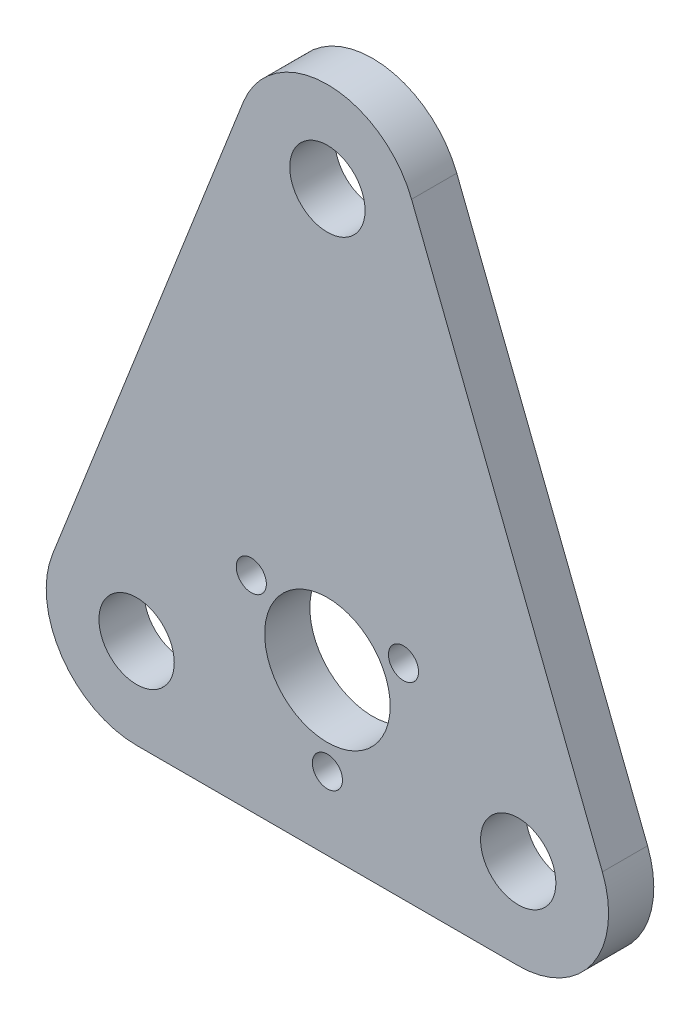
ISO-10303-21;
HEADER;
FILE_DESCRIPTION(('STEP AP214'),'2;1');
FILE_NAME('part.step','',(''),(''),'','','');
FILE_SCHEMA(('AUTOMOTIVE_DESIGN { 1 0 10303 214 1 1 1 1 }'));
ENDSEC;
DATA;
#1=APPLICATION_CONTEXT('core data for automotive mechanical design processes');
#2=APPLICATION_PROTOCOL_DEFINITION('international standard','automotive_design',2000,#1);
#3=PRODUCT_CONTEXT('',#1,'mechanical');
#4=PRODUCT('Part','Part','',(#3));
#5=PRODUCT_RELATED_PRODUCT_CATEGORY('part','',(#4));
#6=PRODUCT_DEFINITION_FORMATION('','',#4);
#7=PRODUCT_DEFINITION_CONTEXT('part definition',#1,'design');
#8=PRODUCT_DEFINITION('design','',#6,#7);
#9=PRODUCT_DEFINITION_SHAPE('','',#8);
#10=(LENGTH_UNIT() NAMED_UNIT(*) SI_UNIT(.MILLI.,.METRE.));
#11=(NAMED_UNIT(*) PLANE_ANGLE_UNIT() SI_UNIT($,.RADIAN.));
#12=(NAMED_UNIT(*) SI_UNIT($,.STERADIAN.) SOLID_ANGLE_UNIT());
#13=UNCERTAINTY_MEASURE_WITH_UNIT(LENGTH_MEASURE(1.E-05),#10,'distance_accuracy_value','');
#14=(GEOMETRIC_REPRESENTATION_CONTEXT(3) GLOBAL_UNCERTAINTY_ASSIGNED_CONTEXT((#13)) GLOBAL_UNIT_ASSIGNED_CONTEXT((#10,
#11,#12)) REPRESENTATION_CONTEXT('',''));
#15=CARTESIAN_POINT('',(0.,0.,0.));
#16=DIRECTION('',(0.,0.,1.));
#17=DIRECTION('',(1.,0.,0.));
#18=AXIS2_PLACEMENT_3D('',#15,#16,#17);
#19=CARTESIAN_POINT('',(44.9490759581409,17.6089163547356,4.5));
#20=DIRECTION('',(0.931101085074803,0.364761249823119,0.));
#21=DIRECTION('',(-0.364761249823119,0.931101085074803,0.));
#22=AXIS2_PLACEMENT_3D('',#19,#20,#21);
#23=PLANE('',#22);
#24=DIRECTION('',(0.364761249823119,-0.931101085074803,0.));
#25=VECTOR('',#24,1.);
#26=CARTESIAN_POINT('',(44.9490759581409,17.6089163547356,-4.5));
#27=LINE('',#26,#25);
#28=CARTESIAN_POINT('',(16.7598195313465,89.5657024968162,-4.5));
#29=VERTEX_POINT('',#28);
#30=CARTESIAN_POINT('',(54.7598195313465,-7.43429750318386,-4.5));
#31=VERTEX_POINT('',#30);
#32=EDGE_CURVE('E148',#29,#31,#27,.T.);
#33=ORIENTED_EDGE('',*,*,#32,.F.);
#34=DIRECTION('',(0.,0.,-1.));
#35=VECTOR('',#34,1.);
#36=CARTESIAN_POINT('',(16.7598195313465,89.5657024968162,4.5));
#37=LINE('',#36,#35);
#38=CARTESIAN_POINT('',(16.7598195313465,89.5657024968162,4.5));
#39=VERTEX_POINT('',#38);
#40=EDGE_CURVE('E11',#39,#29,#37,.T.);
#41=ORIENTED_EDGE('',*,*,#40,.F.);
#42=DIRECTION('',(0.364761249823119,-0.931101085074803,0.));
#43=VECTOR('',#42,1.);
#44=CARTESIAN_POINT('',(44.9490759581409,17.6089163547356,4.5));
#45=LINE('',#44,#43);
#46=CARTESIAN_POINT('',(54.7598195313465,-7.43429750318386,4.5));
#47=VERTEX_POINT('',#46);
#48=EDGE_CURVE('E329',#39,#47,#45,.T.);
#49=ORIENTED_EDGE('',*,*,#48,.T.);
#50=DIRECTION('',(0.,0.,-1.));
#51=VECTOR('',#50,1.);
#52=CARTESIAN_POINT('',(54.7598195313465,-7.43429750318386,4.5));
#53=LINE('',#52,#51);
#54=EDGE_CURVE('E90',#47,#31,#53,.T.);
#55=ORIENTED_EDGE('',*,*,#54,.T.);
#56=EDGE_LOOP('',(#33,#41,#49,#55));
#57=FACE_BOUND('',#56,.T.);
#58=ADVANCED_FACE('F45',(#57),#23,.T.);
#59=CARTESIAN_POINT('',(0.,83.,4.5));
#60=DIRECTION('',(0.,0.,-1.));
#61=DIRECTION('',(-1.,0.,0.));
#62=AXIS2_PLACEMENT_3D('',#59,#60,#61);
#63=CYLINDRICAL_SURFACE('',#62,18.);
#64=CARTESIAN_POINT('',(0.,83.,-4.5));
#65=DIRECTION('',(0.,0.,1.));
#66=DIRECTION('',(1.,0.,0.));
#67=AXIS2_PLACEMENT_3D('',#64,#65,#66);
#68=CIRCLE('',#67,18.);
#69=CARTESIAN_POINT('',(-16.7598195313465,89.5657024968161,-4.5));
#70=VERTEX_POINT('',#69);
#71=EDGE_CURVE('E151',#29,#70,#68,.T.);
#72=ORIENTED_EDGE('',*,*,#71,.T.);
#73=DIRECTION('',(0.,0.,-1.));
#74=VECTOR('',#73,1.);
#75=CARTESIAN_POINT('',(-16.7598195313465,89.5657024968161,4.5));
#76=LINE('',#75,#74);
#77=CARTESIAN_POINT('',(-16.7598195313465,89.5657024968161,4.5));
#78=VERTEX_POINT('',#77);
#79=EDGE_CURVE('E54',#78,#70,#76,.T.);
#80=ORIENTED_EDGE('',*,*,#79,.F.);
#81=CARTESIAN_POINT('',(0.,83.,4.5));
#82=DIRECTION('',(0.,0.,1.));
#83=DIRECTION('',(1.,0.,0.));
#84=AXIS2_PLACEMENT_3D('',#81,#82,#83);
#85=CIRCLE('',#84,18.);
#86=EDGE_CURVE('E330',#39,#78,#85,.T.);
#87=ORIENTED_EDGE('',*,*,#86,.F.);
#88=ORIENTED_EDGE('',*,*,#40,.T.);
#89=EDGE_LOOP('',(#72,#80,#87,#88));
#90=FACE_BOUND('',#89,.T.);
#91=ADVANCED_FACE('F171',(#90),#63,.T.);
#92=CARTESIAN_POINT('',(-44.9490759581409,17.6089163547356,4.5));
#93=DIRECTION('',(0.931101085074803,-0.364761249823119,0.));
#94=DIRECTION('',(0.364761249823119,0.931101085074803,0.));
#95=AXIS2_PLACEMENT_3D('',#92,#93,#94);
#96=PLANE('',#95);
#97=DIRECTION('',(-0.364761249823119,-0.931101085074803,0.));
#98=VECTOR('',#97,1.);
#99=CARTESIAN_POINT('',(-44.9490759581409,17.6089163547356,-4.5));
#100=LINE('',#99,#98);
#101=CARTESIAN_POINT('',(-54.7598195313465,-7.43429750318387,-4.5));
#102=VERTEX_POINT('',#101);
#103=EDGE_CURVE('E154',#70,#102,#100,.T.);
#104=ORIENTED_EDGE('',*,*,#103,.T.);
#105=DIRECTION('',(0.,0.,-1.));
#106=VECTOR('',#105,1.);
#107=CARTESIAN_POINT('',(-54.7598195313465,-7.43429750318387,4.5));
#108=LINE('',#107,#106);
#109=CARTESIAN_POINT('',(-54.7598195313465,-7.43429750318387,4.5));
#110=VERTEX_POINT('',#109);
#111=EDGE_CURVE('E120',#110,#102,#108,.T.);
#112=ORIENTED_EDGE('',*,*,#111,.F.);
#113=DIRECTION('',(-0.364761249823119,-0.931101085074803,0.));
#114=VECTOR('',#113,1.);
#115=CARTESIAN_POINT('',(-44.9490759581409,17.6089163547356,4.5));
#116=LINE('',#115,#114);
#117=EDGE_CURVE('E108',#78,#110,#116,.T.);
#118=ORIENTED_EDGE('',*,*,#117,.F.);
#119=ORIENTED_EDGE('',*,*,#79,.T.);
#120=EDGE_LOOP('',(#104,#112,#118,#119));
#121=FACE_BOUND('',#120,.T.);
#122=ADVANCED_FACE('F168',(#121),#96,.F.);
#123=CARTESIAN_POINT('',(-38.,-14.,4.5));
#124=DIRECTION('',(0.,0.,-1.));
#125=DIRECTION('',(-1.,0.,0.));
#126=AXIS2_PLACEMENT_3D('',#123,#124,#125);
#127=CYLINDRICAL_SURFACE('',#126,18.);
#128=CARTESIAN_POINT('',(-38.,-14.,-4.5));
#129=DIRECTION('',(0.,0.,1.));
#130=DIRECTION('',(1.,0.,0.));
#131=AXIS2_PLACEMENT_3D('',#128,#129,#130);
#132=CIRCLE('',#131,18.);
#133=CARTESIAN_POINT('',(-38.,-32.,-4.5));
#134=VERTEX_POINT('',#133);
#135=EDGE_CURVE('E116',#102,#134,#132,.T.);
#136=ORIENTED_EDGE('',*,*,#135,.T.);
#137=DIRECTION('',(0.,0.,-1.));
#138=VECTOR('',#137,1.);
#139=CARTESIAN_POINT('',(-38.,-32.,4.5));
#140=LINE('',#139,#138);
#141=CARTESIAN_POINT('',(-38.,-32.,4.5));
#142=VERTEX_POINT('',#141);
#143=EDGE_CURVE('E114',#142,#134,#140,.T.);
#144=ORIENTED_EDGE('',*,*,#143,.F.);
#145=CARTESIAN_POINT('',(-38.,-14.,4.5));
#146=DIRECTION('',(0.,0.,1.));
#147=DIRECTION('',(1.,0.,0.));
#148=AXIS2_PLACEMENT_3D('',#145,#146,#147);
#149=CIRCLE('',#148,18.);
#150=EDGE_CURVE('E102',#110,#142,#149,.T.);
#151=ORIENTED_EDGE('',*,*,#150,.F.);
#152=ORIENTED_EDGE('',*,*,#111,.T.);
#153=EDGE_LOOP('',(#136,#144,#151,#152));
#154=FACE_BOUND('',#153,.T.);
#155=ADVANCED_FACE('F115',(#154),#127,.T.);
#156=CARTESIAN_POINT('',(0.,-32.,4.5));
#157=DIRECTION('',(0.,-1.,0.));
#158=DIRECTION('',(1.,0.,0.));
#159=AXIS2_PLACEMENT_3D('',#156,#157,#158);
#160=PLANE('',#159);
#161=DIRECTION('',(-1.,0.,0.));
#162=VECTOR('',#161,1.);
#163=CARTESIAN_POINT('',(0.,-32.,-4.5));
#164=LINE('',#163,#162);
#165=CARTESIAN_POINT('',(38.,-32.,-4.5));
#166=VERTEX_POINT('',#165);
#167=EDGE_CURVE('E158',#166,#134,#164,.T.);
#168=ORIENTED_EDGE('',*,*,#167,.F.);
#169=DIRECTION('',(0.,0.,-1.));
#170=VECTOR('',#169,1.);
#171=CARTESIAN_POINT('',(38.,-32.,4.5));
#172=LINE('',#171,#170);
#173=CARTESIAN_POINT('',(38.,-32.,4.5));
#174=VERTEX_POINT('',#173);
#175=EDGE_CURVE('E83',#174,#166,#172,.T.);
#176=ORIENTED_EDGE('',*,*,#175,.F.);
#177=DIRECTION('',(-1.,0.,0.));
#178=VECTOR('',#177,1.);
#179=CARTESIAN_POINT('',(0.,-32.,4.5));
#180=LINE('',#179,#178);
#181=EDGE_CURVE('E106',#174,#142,#180,.T.);
#182=ORIENTED_EDGE('',*,*,#181,.T.);
#183=ORIENTED_EDGE('',*,*,#143,.T.);
#184=EDGE_LOOP('',(#168,#176,#182,#183));
#185=FACE_BOUND('',#184,.T.);
#186=ADVANCED_FACE('F122',(#185),#160,.T.);
#187=CARTESIAN_POINT('',(-15.1554445662276,8.75000000000006,4.5));
#188=DIRECTION('',(0.,0.,-1.));
#189=DIRECTION('',(-1.,0.,0.));
#190=AXIS2_PLACEMENT_3D('',#187,#188,#189);
#191=CYLINDRICAL_SURFACE('',#190,3.);
#192=CARTESIAN_POINT('',(-15.1554445662276,8.75000000000006,4.5));
#193=DIRECTION('',(0.,0.,1.));
#194=DIRECTION('',(1.,0.,0.));
#195=AXIS2_PLACEMENT_3D('',#192,#193,#194);
#196=CIRCLE('',#195,3.);
#197=CARTESIAN_POINT('',(-12.1554445662276,8.75000000000006,4.5));
#198=VERTEX_POINT('',#197);
#199=EDGE_CURVE('E331',#198,#198,#196,.T.);
#200=ORIENTED_EDGE('',*,*,#199,.T.);
#201=EDGE_LOOP('',(#200));
#202=FACE_BOUND('',#201,.T.);
#203=CARTESIAN_POINT('',(-15.1554445662276,8.75000000000006,-4.5));
#204=DIRECTION('',(0.,0.,1.));
#205=DIRECTION('',(1.,0.,0.));
#206=AXIS2_PLACEMENT_3D('',#203,#204,#205);
#207=CIRCLE('',#206,3.);
#208=CARTESIAN_POINT('',(-12.1554445662276,8.75000000000006,-4.5));
#209=VERTEX_POINT('',#208);
#210=EDGE_CURVE('E145',#209,#209,#207,.T.);
#211=ORIENTED_EDGE('',*,*,#210,.F.);
#212=EDGE_LOOP('',(#211));
#213=FACE_BOUND('',#212,.T.);
#214=ADVANCED_FACE('F182',(#202,#213),#191,.F.);
#215=CARTESIAN_POINT('',(0.,0.,4.5));
#216=DIRECTION('',(0.,0.,-1.));
#217=DIRECTION('',(-1.,0.,0.));
#218=AXIS2_PLACEMENT_3D('',#215,#216,#217);
#219=CYLINDRICAL_SURFACE('',#218,12.5);
#220=CARTESIAN_POINT('',(0.,0.,4.5));
#221=DIRECTION('',(0.,0.,1.));
#222=DIRECTION('',(1.,0.,0.));
#223=AXIS2_PLACEMENT_3D('',#220,#221,#222);
#224=CIRCLE('',#223,12.5);
#225=CARTESIAN_POINT('',(12.5,0.,4.5));
#226=VERTEX_POINT('',#225);
#227=EDGE_CURVE('E335',#226,#226,#224,.T.);
#228=ORIENTED_EDGE('',*,*,#227,.T.);
#229=EDGE_LOOP('',(#228));
#230=FACE_BOUND('',#229,.T.);
#231=CARTESIAN_POINT('',(0.,0.,-4.5));
#232=DIRECTION('',(0.,0.,1.));
#233=DIRECTION('',(1.,0.,0.));
#234=AXIS2_PLACEMENT_3D('',#231,#232,#233);
#235=CIRCLE('',#234,12.5);
#236=CARTESIAN_POINT('',(12.5,0.,-4.5));
#237=VERTEX_POINT('',#236);
#238=EDGE_CURVE('E142',#237,#237,#235,.T.);
#239=ORIENTED_EDGE('',*,*,#238,.F.);
#240=EDGE_LOOP('',(#239));
#241=FACE_BOUND('',#240,.T.);
#242=ADVANCED_FACE('F185',(#230,#241),#219,.F.);
#243=CARTESIAN_POINT('',(0.,-17.5,4.5));
#244=DIRECTION('',(0.,0.,-1.));
#245=DIRECTION('',(-1.,0.,0.));
#246=AXIS2_PLACEMENT_3D('',#243,#244,#245);
#247=CYLINDRICAL_SURFACE('',#246,3.);
#248=CARTESIAN_POINT('',(0.,-17.5,4.5));
#249=DIRECTION('',(0.,0.,1.));
#250=DIRECTION('',(1.,0.,0.));
#251=AXIS2_PLACEMENT_3D('',#248,#249,#250);
#252=CIRCLE('',#251,3.);
#253=CARTESIAN_POINT('',(3.00000000000001,-17.5,4.5));
#254=VERTEX_POINT('',#253);
#255=EDGE_CURVE('E340',#254,#254,#252,.T.);
#256=ORIENTED_EDGE('',*,*,#255,.T.);
#257=EDGE_LOOP('',(#256));
#258=FACE_BOUND('',#257,.T.);
#259=CARTESIAN_POINT('',(0.,-17.5,-4.5));
#260=DIRECTION('',(0.,0.,1.));
#261=DIRECTION('',(1.,0.,0.));
#262=AXIS2_PLACEMENT_3D('',#259,#260,#261);
#263=CIRCLE('',#262,3.);
#264=CARTESIAN_POINT('',(3.00000000000001,-17.5,-4.5));
#265=VERTEX_POINT('',#264);
#266=EDGE_CURVE('E139',#265,#265,#263,.T.);
#267=ORIENTED_EDGE('',*,*,#266,.F.);
#268=EDGE_LOOP('',(#267));
#269=FACE_BOUND('',#268,.T.);
#270=ADVANCED_FACE('F189',(#258,#269),#247,.F.);
#271=CARTESIAN_POINT('',(-38.,-14.,4.5));
#272=DIRECTION('',(0.,0.,-1.));
#273=DIRECTION('',(-1.,0.,0.));
#274=AXIS2_PLACEMENT_3D('',#271,#272,#273);
#275=CYLINDRICAL_SURFACE('',#274,7.5);
#276=CARTESIAN_POINT('',(-38.,-14.,4.5));
#277=DIRECTION('',(0.,0.,1.));
#278=DIRECTION('',(1.,0.,0.));
#279=AXIS2_PLACEMENT_3D('',#276,#277,#278);
#280=CIRCLE('',#279,7.5);
#281=CARTESIAN_POINT('',(-30.5,-14.,4.5));
#282=VERTEX_POINT('',#281);
#283=EDGE_CURVE('E343',#282,#282,#280,.T.);
#284=ORIENTED_EDGE('',*,*,#283,.T.);
#285=EDGE_LOOP('',(#284));
#286=FACE_BOUND('',#285,.T.);
#287=CARTESIAN_POINT('',(-38.,-14.,-4.5));
#288=DIRECTION('',(0.,0.,1.));
#289=DIRECTION('',(1.,0.,0.));
#290=AXIS2_PLACEMENT_3D('',#287,#288,#289);
#291=CIRCLE('',#290,7.5);
#292=CARTESIAN_POINT('',(-30.5,-14.,-4.5));
#293=VERTEX_POINT('',#292);
#294=EDGE_CURVE('E136',#293,#293,#291,.T.);
#295=ORIENTED_EDGE('',*,*,#294,.F.);
#296=EDGE_LOOP('',(#295));
#297=FACE_BOUND('',#296,.T.);
#298=ADVANCED_FACE('F193',(#286,#297),#275,.F.);
#299=CARTESIAN_POINT('',(38.,-14.,4.5));
#300=DIRECTION('',(0.,0.,-1.));
#301=DIRECTION('',(-1.,0.,0.));
#302=AXIS2_PLACEMENT_3D('',#299,#300,#301);
#303=CYLINDRICAL_SURFACE('',#302,7.5);
#304=CARTESIAN_POINT('',(38.,-14.,4.5));
#305=DIRECTION('',(0.,0.,1.));
#306=DIRECTION('',(1.,0.,0.));
#307=AXIS2_PLACEMENT_3D('',#304,#305,#306);
#308=CIRCLE('',#307,7.5);
#309=CARTESIAN_POINT('',(45.5,-14.,4.5));
#310=VERTEX_POINT('',#309);
#311=EDGE_CURVE('E346',#310,#310,#308,.T.);
#312=ORIENTED_EDGE('',*,*,#311,.T.);
#313=EDGE_LOOP('',(#312));
#314=FACE_BOUND('',#313,.T.);
#315=CARTESIAN_POINT('',(38.,-14.,-4.5));
#316=DIRECTION('',(0.,0.,1.));
#317=DIRECTION('',(1.,0.,0.));
#318=AXIS2_PLACEMENT_3D('',#315,#316,#317);
#319=CIRCLE('',#318,7.5);
#320=CARTESIAN_POINT('',(45.5,-14.,-4.5));
#321=VERTEX_POINT('',#320);
#322=EDGE_CURVE('E133',#321,#321,#319,.T.);
#323=ORIENTED_EDGE('',*,*,#322,.F.);
#324=EDGE_LOOP('',(#323));
#325=FACE_BOUND('',#324,.T.);
#326=ADVANCED_FACE('F197',(#314,#325),#303,.F.);
#327=CARTESIAN_POINT('',(0.,83.,4.5));
#328=DIRECTION('',(0.,0.,-1.));
#329=DIRECTION('',(-1.,0.,0.));
#330=AXIS2_PLACEMENT_3D('',#327,#328,#329);
#331=CYLINDRICAL_SURFACE('',#330,7.5);
#332=CARTESIAN_POINT('',(0.,83.,4.5));
#333=DIRECTION('',(0.,0.,1.));
#334=DIRECTION('',(1.,0.,0.));
#335=AXIS2_PLACEMENT_3D('',#332,#333,#334);
#336=CIRCLE('',#335,7.5);
#337=CARTESIAN_POINT('',(7.5,83.,4.5));
#338=VERTEX_POINT('',#337);
#339=EDGE_CURVE('E212',#338,#338,#336,.T.);
#340=ORIENTED_EDGE('',*,*,#339,.T.);
#341=EDGE_LOOP('',(#340));
#342=FACE_BOUND('',#341,.T.);
#343=CARTESIAN_POINT('',(0.,83.,-4.5));
#344=DIRECTION('',(0.,0.,1.));
#345=DIRECTION('',(1.,0.,0.));
#346=AXIS2_PLACEMENT_3D('',#343,#344,#345);
#347=CIRCLE('',#346,7.5);
#348=CARTESIAN_POINT('',(7.5,83.,-4.5));
#349=VERTEX_POINT('',#348);
#350=EDGE_CURVE('E130',#349,#349,#347,.T.);
#351=ORIENTED_EDGE('',*,*,#350,.F.);
#352=EDGE_LOOP('',(#351));
#353=FACE_BOUND('',#352,.T.);
#354=ADVANCED_FACE('F200',(#342,#353),#331,.F.);
#355=CARTESIAN_POINT('',(15.1554445662277,8.75000000000006,4.5));
#356=DIRECTION('',(0.,0.,-1.));
#357=DIRECTION('',(-1.,0.,0.));
#358=AXIS2_PLACEMENT_3D('',#355,#356,#357);
#359=CYLINDRICAL_SURFACE('',#358,3.);
#360=CARTESIAN_POINT('',(15.1554445662277,8.75000000000006,4.5));
#361=DIRECTION('',(0.,0.,1.));
#362=DIRECTION('',(1.,0.,0.));
#363=AXIS2_PLACEMENT_3D('',#360,#361,#362);
#364=CIRCLE('',#363,3.);
#365=CARTESIAN_POINT('',(18.1554445662277,8.75000000000006,4.5));
#366=VERTEX_POINT('',#365);
#367=EDGE_CURVE('E162',#366,#366,#364,.T.);
#368=ORIENTED_EDGE('',*,*,#367,.T.);
#369=EDGE_LOOP('',(#368));
#370=FACE_BOUND('',#369,.T.);
#371=CARTESIAN_POINT('',(15.1554445662277,8.75000000000006,-4.5));
#372=DIRECTION('',(0.,0.,1.));
#373=DIRECTION('',(1.,0.,0.));
#374=AXIS2_PLACEMENT_3D('',#371,#372,#373);
#375=CIRCLE('',#374,3.);
#376=CARTESIAN_POINT('',(18.1554445662277,8.75000000000006,-4.5));
#377=VERTEX_POINT('',#376);
#378=EDGE_CURVE('E127',#377,#377,#375,.T.);
#379=ORIENTED_EDGE('',*,*,#378,.F.);
#380=EDGE_LOOP('',(#379));
#381=FACE_BOUND('',#380,.T.);
#382=ADVANCED_FACE('F47',(#370,#381),#359,.F.);
#383=CARTESIAN_POINT('',(38.,-14.,4.5));
#384=DIRECTION('',(0.,0.,-1.));
#385=DIRECTION('',(-1.,0.,0.));
#386=AXIS2_PLACEMENT_3D('',#383,#384,#385);
#387=CYLINDRICAL_SURFACE('',#386,18.);
#388=CARTESIAN_POINT('',(38.,-14.,-4.5));
#389=DIRECTION('',(0.,0.,1.));
#390=DIRECTION('',(1.,0.,0.));
#391=AXIS2_PLACEMENT_3D('',#388,#389,#390);
#392=CIRCLE('',#391,18.);
#393=EDGE_CURVE('E160',#166,#31,#392,.T.);
#394=ORIENTED_EDGE('',*,*,#393,.T.);
#395=ORIENTED_EDGE('',*,*,#54,.F.);
#396=CARTESIAN_POINT('',(38.,-14.,4.5));
#397=DIRECTION('',(0.,0.,1.));
#398=DIRECTION('',(1.,0.,0.));
#399=AXIS2_PLACEMENT_3D('',#396,#397,#398);
#400=CIRCLE('',#399,18.);
#401=EDGE_CURVE('E62',#174,#47,#400,.T.);
#402=ORIENTED_EDGE('',*,*,#401,.F.);
#403=ORIENTED_EDGE('',*,*,#175,.T.);
#404=EDGE_LOOP('',(#394,#395,#402,#403));
#405=FACE_BOUND('',#404,.T.);
#406=ADVANCED_FACE('F207',(#405),#387,.T.);
#407=CARTESIAN_POINT('',(0.,0.,4.5));
#408=DIRECTION('',(0.,0.,1.));
#409=DIRECTION('',(1.,0.,0.));
#410=AXIS2_PLACEMENT_3D('',#407,#408,#409);
#411=PLANE('',#410);
#412=ORIENTED_EDGE('',*,*,#367,.F.);
#413=EDGE_LOOP('',(#412));
#414=FACE_BOUND('',#413,.T.);
#415=ORIENTED_EDGE('',*,*,#339,.F.);
#416=EDGE_LOOP('',(#415));
#417=FACE_BOUND('',#416,.T.);
#418=ORIENTED_EDGE('',*,*,#311,.F.);
#419=EDGE_LOOP('',(#418));
#420=FACE_BOUND('',#419,.T.);
#421=ORIENTED_EDGE('',*,*,#283,.F.);
#422=EDGE_LOOP('',(#421));
#423=FACE_BOUND('',#422,.T.);
#424=ORIENTED_EDGE('',*,*,#255,.F.);
#425=EDGE_LOOP('',(#424));
#426=FACE_BOUND('',#425,.T.);
#427=ORIENTED_EDGE('',*,*,#227,.F.);
#428=EDGE_LOOP('',(#427));
#429=FACE_BOUND('',#428,.T.);
#430=ORIENTED_EDGE('',*,*,#199,.F.);
#431=EDGE_LOOP('',(#430));
#432=FACE_BOUND('',#431,.T.);
#433=ORIENTED_EDGE('',*,*,#48,.F.);
#434=ORIENTED_EDGE('',*,*,#86,.T.);
#435=ORIENTED_EDGE('',*,*,#117,.T.);
#436=ORIENTED_EDGE('',*,*,#150,.T.);
#437=ORIENTED_EDGE('',*,*,#181,.F.);
#438=ORIENTED_EDGE('',*,*,#401,.T.);
#439=EDGE_LOOP('',(#433,#434,#435,#436,#437,#438));
#440=FACE_BOUND('',#439,.T.);
#441=ADVANCED_FACE('F104',(#414,#417,#420,#423,#426,#429,#432,#440),#411,.T.);
#442=CARTESIAN_POINT('',(0.,0.,-4.5));
#443=DIRECTION('',(0.,0.,1.));
#444=DIRECTION('',(1.,0.,0.));
#445=AXIS2_PLACEMENT_3D('',#442,#443,#444);
#446=PLANE('',#445);
#447=ORIENTED_EDGE('',*,*,#378,.T.);
#448=EDGE_LOOP('',(#447));
#449=FACE_BOUND('',#448,.T.);
#450=ORIENTED_EDGE('',*,*,#350,.T.);
#451=EDGE_LOOP('',(#450));
#452=FACE_BOUND('',#451,.T.);
#453=ORIENTED_EDGE('',*,*,#322,.T.);
#454=EDGE_LOOP('',(#453));
#455=FACE_BOUND('',#454,.T.);
#456=ORIENTED_EDGE('',*,*,#294,.T.);
#457=EDGE_LOOP('',(#456));
#458=FACE_BOUND('',#457,.T.);
#459=ORIENTED_EDGE('',*,*,#266,.T.);
#460=EDGE_LOOP('',(#459));
#461=FACE_BOUND('',#460,.T.);
#462=ORIENTED_EDGE('',*,*,#238,.T.);
#463=EDGE_LOOP('',(#462));
#464=FACE_BOUND('',#463,.T.);
#465=ORIENTED_EDGE('',*,*,#210,.T.);
#466=EDGE_LOOP('',(#465));
#467=FACE_BOUND('',#466,.T.);
#468=ORIENTED_EDGE('',*,*,#32,.T.);
#469=ORIENTED_EDGE('',*,*,#393,.F.);
#470=ORIENTED_EDGE('',*,*,#167,.T.);
#471=ORIENTED_EDGE('',*,*,#135,.F.);
#472=ORIENTED_EDGE('',*,*,#103,.F.);
#473=ORIENTED_EDGE('',*,*,#71,.F.);
#474=EDGE_LOOP('',(#468,#469,#470,#471,#472,#473));
#475=FACE_BOUND('',#474,.T.);
#476=ADVANCED_FACE('F173',(#449,#452,#455,#458,#461,#464,#467,#475),#446,.F.);
#477=CLOSED_SHELL('',(#58,#91,#122,#155,#186,#214,#242,#270,#298,#326,#354,#382,#406,#441,#476));
#478=MANIFOLD_SOLID_BREP('B2',#477);
#479=ADVANCED_BREP_SHAPE_REPRESENTATION('',(#18,#478),#14);
#480=SHAPE_DEFINITION_REPRESENTATION(#9,#479);
ENDSEC;
END-ISO-10303-21;
